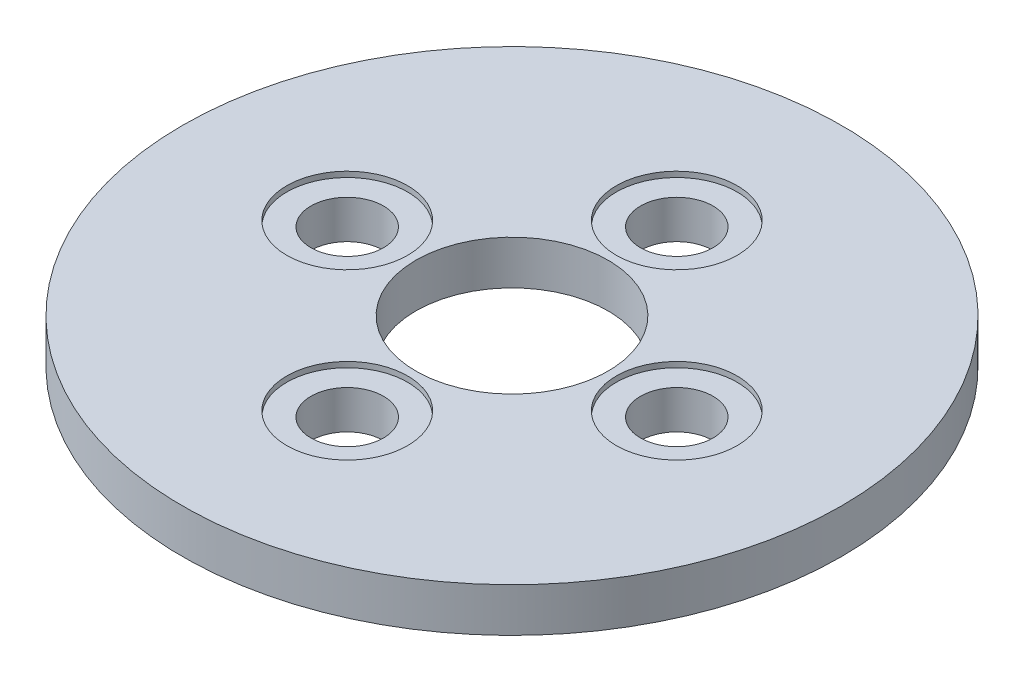
ISO-10303-21;
HEADER;
FILE_DESCRIPTION(('STEP AP214'),'2;1');
FILE_NAME('part.step','',(''),(''),'','','');
FILE_SCHEMA(('AUTOMOTIVE_DESIGN { 1 0 10303 214 1 1 1 1 }'));
ENDSEC;
DATA;
#1=APPLICATION_CONTEXT('core data for automotive mechanical design processes');
#2=APPLICATION_PROTOCOL_DEFINITION('international standard','automotive_design',2000,#1);
#3=PRODUCT_CONTEXT('',#1,'mechanical');
#4=PRODUCT('Part','Part','',(#3));
#5=PRODUCT_RELATED_PRODUCT_CATEGORY('part','',(#4));
#6=PRODUCT_DEFINITION_FORMATION('','',#4);
#7=PRODUCT_DEFINITION_CONTEXT('part definition',#1,'design');
#8=PRODUCT_DEFINITION('design','',#6,#7);
#9=PRODUCT_DEFINITION_SHAPE('','',#8);
#10=(LENGTH_UNIT() NAMED_UNIT(*) SI_UNIT(.MILLI.,.METRE.));
#11=(NAMED_UNIT(*) PLANE_ANGLE_UNIT() SI_UNIT($,.RADIAN.));
#12=(NAMED_UNIT(*) SI_UNIT($,.STERADIAN.) SOLID_ANGLE_UNIT());
#13=UNCERTAINTY_MEASURE_WITH_UNIT(LENGTH_MEASURE(1.E-05),#10,'distance_accuracy_value','');
#14=(GEOMETRIC_REPRESENTATION_CONTEXT(3) GLOBAL_UNCERTAINTY_ASSIGNED_CONTEXT((#13)) GLOBAL_UNIT_ASSIGNED_CONTEXT((#10,
#11,#12)) REPRESENTATION_CONTEXT('',''));
#15=CARTESIAN_POINT('',(0.,0.,0.));
#16=DIRECTION('',(0.,0.,1.));
#17=DIRECTION('',(1.,0.,0.));
#18=AXIS2_PLACEMENT_3D('',#15,#16,#17);
#19=CARTESIAN_POINT('',(0.,4.,0.));
#20=DIRECTION('',(0.,-1.,0.));
#21=DIRECTION('',(1.,0.,0.));
#22=AXIS2_PLACEMENT_3D('',#19,#20,#21);
#23=PLANE('',#22);
#24=CARTESIAN_POINT('',(15.,4.,0.));
#25=DIRECTION('',(0.,1.,0.));
#26=DIRECTION('',(0.,0.,1.));
#27=AXIS2_PLACEMENT_3D('',#24,#25,#26);
#28=CIRCLE('',#27,5.49999999999999);
#29=CARTESIAN_POINT('',(15.,4.,5.49999999999999));
#30=VERTEX_POINT('',#29);
#31=EDGE_CURVE('E122',#30,#30,#28,.T.);
#32=ORIENTED_EDGE('',*,*,#31,.F.);
#33=EDGE_LOOP('',(#32));
#34=FACE_BOUND('',#33,.T.);
#35=CARTESIAN_POINT('',(0.,4.,15.));
#36=DIRECTION('',(0.,1.,0.));
#37=DIRECTION('',(0.,0.,1.));
#38=AXIS2_PLACEMENT_3D('',#35,#36,#37);
#39=CIRCLE('',#38,5.49999999999999);
#40=CARTESIAN_POINT('',(0.,4.,20.5));
#41=VERTEX_POINT('',#40);
#42=EDGE_CURVE('E106',#41,#41,#39,.T.);
#43=ORIENTED_EDGE('',*,*,#42,.F.);
#44=EDGE_LOOP('',(#43));
#45=FACE_BOUND('',#44,.T.);
#46=CARTESIAN_POINT('',(-15.,4.,0.));
#47=DIRECTION('',(0.,1.,0.));
#48=DIRECTION('',(0.,0.,1.));
#49=AXIS2_PLACEMENT_3D('',#46,#47,#48);
#50=CIRCLE('',#49,5.49999999999999);
#51=CARTESIAN_POINT('',(-15.,4.,5.49999999999999));
#52=VERTEX_POINT('',#51);
#53=EDGE_CURVE('E90',#52,#52,#50,.T.);
#54=ORIENTED_EDGE('',*,*,#53,.F.);
#55=EDGE_LOOP('',(#54));
#56=FACE_BOUND('',#55,.T.);
#57=CARTESIAN_POINT('',(0.,4.,-15.));
#58=DIRECTION('',(0.,1.,0.));
#59=DIRECTION('',(0.,0.,1.));
#60=AXIS2_PLACEMENT_3D('',#57,#58,#59);
#61=CIRCLE('',#60,5.49999999999999);
#62=CARTESIAN_POINT('',(0.,4.,-9.50000000000001));
#63=VERTEX_POINT('',#62);
#64=EDGE_CURVE('E74',#63,#63,#61,.T.);
#65=ORIENTED_EDGE('',*,*,#64,.F.);
#66=EDGE_LOOP('',(#65));
#67=FACE_BOUND('',#66,.T.);
#68=CARTESIAN_POINT('',(0.,4.,0.));
#69=DIRECTION('',(0.,1.,0.));
#70=DIRECTION('',(-1.,0.,0.));
#71=AXIS2_PLACEMENT_3D('',#68,#69,#70);
#72=CIRCLE('',#71,8.75);
#73=CARTESIAN_POINT('',(-8.75,4.,0.));
#74=VERTEX_POINT('',#73);
#75=EDGE_CURVE('E10',#74,#74,#72,.T.);
#76=ORIENTED_EDGE('',*,*,#75,.F.);
#77=EDGE_LOOP('',(#76));
#78=FACE_BOUND('',#77,.T.);
#79=CARTESIAN_POINT('',(0.,4.,0.));
#80=DIRECTION('',(0.,1.,0.));
#81=DIRECTION('',(-1.,0.,0.));
#82=AXIS2_PLACEMENT_3D('',#79,#80,#81);
#83=CIRCLE('',#82,30.);
#84=CARTESIAN_POINT('',(-30.,4.,0.));
#85=VERTEX_POINT('',#84);
#86=EDGE_CURVE('E56',#85,#85,#83,.T.);
#87=ORIENTED_EDGE('',*,*,#86,.T.);
#88=EDGE_LOOP('',(#87));
#89=FACE_BOUND('',#88,.T.);
#90=ADVANCED_FACE('F39',(#34,#45,#56,#67,#78,#89),#23,.F.);
#91=CARTESIAN_POINT('',(0.,4.,0.));
#92=DIRECTION('',(0.,1.,0.));
#93=DIRECTION('',(-1.,0.,0.));
#94=AXIS2_PLACEMENT_3D('',#91,#92,#93);
#95=CYLINDRICAL_SURFACE('',#94,8.75);
#96=CARTESIAN_POINT('',(0.,0.,0.));
#97=DIRECTION('',(0.,1.,0.));
#98=DIRECTION('',(-1.,0.,0.));
#99=AXIS2_PLACEMENT_3D('',#96,#97,#98);
#100=CIRCLE('',#99,8.75);
#101=CARTESIAN_POINT('',(-8.75,0.,0.));
#102=VERTEX_POINT('',#101);
#103=EDGE_CURVE('E46',#102,#102,#100,.T.);
#104=ORIENTED_EDGE('',*,*,#103,.F.);
#105=EDGE_LOOP('',(#104));
#106=FACE_BOUND('',#105,.T.);
#107=ORIENTED_EDGE('',*,*,#75,.T.);
#108=EDGE_LOOP('',(#107));
#109=FACE_BOUND('',#108,.T.);
#110=ADVANCED_FACE('F131',(#106,#109),#95,.F.);
#111=CARTESIAN_POINT('',(0.,0.,0.));
#112=DIRECTION('',(0.,1.,0.));
#113=DIRECTION('',(-1.,0.,0.));
#114=AXIS2_PLACEMENT_3D('',#111,#112,#113);
#115=PLANE('',#114);
#116=CARTESIAN_POINT('',(15.,0.,0.));
#117=DIRECTION('',(0.,1.,0.));
#118=DIRECTION('',(0.,0.,1.));
#119=AXIS2_PLACEMENT_3D('',#116,#117,#118);
#120=CIRCLE('',#119,3.3);
#121=CARTESIAN_POINT('',(15.,0.,3.3));
#122=VERTEX_POINT('',#121);
#123=EDGE_CURVE('E110',#122,#122,#120,.T.);
#124=ORIENTED_EDGE('',*,*,#123,.T.);
#125=EDGE_LOOP('',(#124));
#126=FACE_BOUND('',#125,.T.);
#127=CARTESIAN_POINT('',(0.,0.,15.));
#128=DIRECTION('',(0.,1.,0.));
#129=DIRECTION('',(0.,0.,1.));
#130=AXIS2_PLACEMENT_3D('',#127,#128,#129);
#131=CIRCLE('',#130,3.3);
#132=CARTESIAN_POINT('',(0.,0.,18.3));
#133=VERTEX_POINT('',#132);
#134=EDGE_CURVE('E94',#133,#133,#131,.T.);
#135=ORIENTED_EDGE('',*,*,#134,.T.);
#136=EDGE_LOOP('',(#135));
#137=FACE_BOUND('',#136,.T.);
#138=CARTESIAN_POINT('',(-15.,0.,0.));
#139=DIRECTION('',(0.,1.,0.));
#140=DIRECTION('',(0.,0.,1.));
#141=AXIS2_PLACEMENT_3D('',#138,#139,#140);
#142=CIRCLE('',#141,3.3);
#143=CARTESIAN_POINT('',(-15.,0.,3.3));
#144=VERTEX_POINT('',#143);
#145=EDGE_CURVE('E78',#144,#144,#142,.T.);
#146=ORIENTED_EDGE('',*,*,#145,.T.);
#147=EDGE_LOOP('',(#146));
#148=FACE_BOUND('',#147,.T.);
#149=CARTESIAN_POINT('',(0.,0.,-15.));
#150=DIRECTION('',(0.,1.,0.));
#151=DIRECTION('',(0.,0.,1.));
#152=AXIS2_PLACEMENT_3D('',#149,#150,#151);
#153=CIRCLE('',#152,3.3);
#154=CARTESIAN_POINT('',(0.,0.,-11.7));
#155=VERTEX_POINT('',#154);
#156=EDGE_CURVE('E62',#155,#155,#153,.T.);
#157=ORIENTED_EDGE('',*,*,#156,.T.);
#158=EDGE_LOOP('',(#157));
#159=FACE_BOUND('',#158,.T.);
#160=CARTESIAN_POINT('',(0.,0.,0.));
#161=DIRECTION('',(0.,1.,0.));
#162=DIRECTION('',(-1.,0.,0.));
#163=AXIS2_PLACEMENT_3D('',#160,#161,#162);
#164=CIRCLE('',#163,30.);
#165=CARTESIAN_POINT('',(-30.,0.,0.));
#166=VERTEX_POINT('',#165);
#167=EDGE_CURVE('E51',#166,#166,#164,.T.);
#168=ORIENTED_EDGE('',*,*,#167,.F.);
#169=EDGE_LOOP('',(#168));
#170=FACE_BOUND('',#169,.T.);
#171=ORIENTED_EDGE('',*,*,#103,.T.);
#172=EDGE_LOOP('',(#171));
#173=FACE_BOUND('',#172,.T.);
#174=ADVANCED_FACE('F145',(#126,#137,#148,#159,#170,#173),#115,.F.);
#175=CARTESIAN_POINT('',(0.,4.,0.));
#176=DIRECTION('',(0.,1.,0.));
#177=DIRECTION('',(-1.,0.,0.));
#178=AXIS2_PLACEMENT_3D('',#175,#176,#177);
#179=CYLINDRICAL_SURFACE('',#178,30.);
#180=ORIENTED_EDGE('',*,*,#86,.F.);
#181=EDGE_LOOP('',(#180));
#182=FACE_BOUND('',#181,.T.);
#183=ORIENTED_EDGE('',*,*,#167,.T.);
#184=EDGE_LOOP('',(#183));
#185=FACE_BOUND('',#184,.T.);
#186=ADVANCED_FACE('F141',(#182,#185),#179,.T.);
#187=CARTESIAN_POINT('',(0.,4.,-15.));
#188=DIRECTION('',(0.,1.,0.));
#189=DIRECTION('',(0.,0.,1.));
#190=AXIS2_PLACEMENT_3D('',#187,#188,#189);
#191=CYLINDRICAL_SURFACE('',#190,3.3);
#192=ORIENTED_EDGE('',*,*,#156,.F.);
#193=EDGE_LOOP('',(#192));
#194=FACE_BOUND('',#193,.T.);
#195=CARTESIAN_POINT('',(0.,3.5,-15.));
#196=DIRECTION('',(0.,1.,0.));
#197=DIRECTION('',(0.,0.,1.));
#198=AXIS2_PLACEMENT_3D('',#195,#196,#197);
#199=CIRCLE('',#198,3.3);
#200=CARTESIAN_POINT('',(0.,3.5,-11.7));
#201=VERTEX_POINT('',#200);
#202=EDGE_CURVE('E66',#201,#201,#199,.T.);
#203=ORIENTED_EDGE('',*,*,#202,.T.);
#204=EDGE_LOOP('',(#203));
#205=FACE_BOUND('',#204,.T.);
#206=ADVANCED_FACE('F144',(#194,#205),#191,.F.);
#207=CARTESIAN_POINT('',(3.3,3.5,-15.));
#208=DIRECTION('',(0.,-1.,0.));
#209=DIRECTION('',(0.,0.,-1.));
#210=AXIS2_PLACEMENT_3D('',#207,#208,#209);
#211=PLANE('',#210);
#212=ORIENTED_EDGE('',*,*,#202,.F.);
#213=EDGE_LOOP('',(#212));
#214=FACE_BOUND('',#213,.T.);
#215=CARTESIAN_POINT('',(0.,3.5,-15.));
#216=DIRECTION('',(0.,1.,0.));
#217=DIRECTION('',(0.,0.,1.));
#218=AXIS2_PLACEMENT_3D('',#215,#216,#217);
#219=CIRCLE('',#218,5.5);
#220=CARTESIAN_POINT('',(0.,3.5,-9.5));
#221=VERTEX_POINT('',#220);
#222=EDGE_CURVE('E70',#221,#221,#219,.T.);
#223=ORIENTED_EDGE('',*,*,#222,.T.);
#224=EDGE_LOOP('',(#223));
#225=FACE_BOUND('',#224,.T.);
#226=ADVANCED_FACE('F160',(#214,#225),#211,.F.);
#227=CARTESIAN_POINT('',(0.,4.,-15.));
#228=DIRECTION('',(0.,1.,0.));
#229=DIRECTION('',(0.,0.,1.));
#230=AXIS2_PLACEMENT_3D('',#227,#228,#229);
#231=CYLINDRICAL_SURFACE('',#230,5.5);
#232=ORIENTED_EDGE('',*,*,#222,.F.);
#233=EDGE_LOOP('',(#232));
#234=FACE_BOUND('',#233,.T.);
#235=ORIENTED_EDGE('',*,*,#64,.T.);
#236=EDGE_LOOP('',(#235));
#237=FACE_BOUND('',#236,.T.);
#238=ADVANCED_FACE('F164',(#234,#237),#231,.F.);
#239=CARTESIAN_POINT('',(-15.,4.,0.));
#240=DIRECTION('',(0.,1.,0.));
#241=DIRECTION('',(0.,0.,1.));
#242=AXIS2_PLACEMENT_3D('',#239,#240,#241);
#243=CYLINDRICAL_SURFACE('',#242,3.3);
#244=ORIENTED_EDGE('',*,*,#145,.F.);
#245=EDGE_LOOP('',(#244));
#246=FACE_BOUND('',#245,.T.);
#247=CARTESIAN_POINT('',(-15.,3.5,0.));
#248=DIRECTION('',(0.,1.,0.));
#249=DIRECTION('',(0.,0.,1.));
#250=AXIS2_PLACEMENT_3D('',#247,#248,#249);
#251=CIRCLE('',#250,3.3);
#252=CARTESIAN_POINT('',(-15.,3.5,3.3));
#253=VERTEX_POINT('',#252);
#254=EDGE_CURVE('E82',#253,#253,#251,.T.);
#255=ORIENTED_EDGE('',*,*,#254,.T.);
#256=EDGE_LOOP('',(#255));
#257=FACE_BOUND('',#256,.T.);
#258=ADVANCED_FACE('F168',(#246,#257),#243,.F.);
#259=CARTESIAN_POINT('',(-11.7,3.5,0.));
#260=DIRECTION('',(0.,-1.,0.));
#261=DIRECTION('',(0.,0.,-1.));
#262=AXIS2_PLACEMENT_3D('',#259,#260,#261);
#263=PLANE('',#262);
#264=ORIENTED_EDGE('',*,*,#254,.F.);
#265=EDGE_LOOP('',(#264));
#266=FACE_BOUND('',#265,.T.);
#267=CARTESIAN_POINT('',(-15.,3.5,0.));
#268=DIRECTION('',(0.,1.,0.));
#269=DIRECTION('',(0.,0.,1.));
#270=AXIS2_PLACEMENT_3D('',#267,#268,#269);
#271=CIRCLE('',#270,5.5);
#272=CARTESIAN_POINT('',(-15.,3.5,5.5));
#273=VERTEX_POINT('',#272);
#274=EDGE_CURVE('E86',#273,#273,#271,.T.);
#275=ORIENTED_EDGE('',*,*,#274,.T.);
#276=EDGE_LOOP('',(#275));
#277=FACE_BOUND('',#276,.T.);
#278=ADVANCED_FACE('F172',(#266,#277),#263,.F.);
#279=CARTESIAN_POINT('',(-15.,4.,0.));
#280=DIRECTION('',(0.,1.,0.));
#281=DIRECTION('',(0.,0.,1.));
#282=AXIS2_PLACEMENT_3D('',#279,#280,#281);
#283=CYLINDRICAL_SURFACE('',#282,5.5);
#284=ORIENTED_EDGE('',*,*,#274,.F.);
#285=EDGE_LOOP('',(#284));
#286=FACE_BOUND('',#285,.T.);
#287=ORIENTED_EDGE('',*,*,#53,.T.);
#288=EDGE_LOOP('',(#287));
#289=FACE_BOUND('',#288,.T.);
#290=ADVANCED_FACE('F176',(#286,#289),#283,.F.);
#291=CARTESIAN_POINT('',(0.,4.,15.));
#292=DIRECTION('',(0.,1.,0.));
#293=DIRECTION('',(0.,0.,1.));
#294=AXIS2_PLACEMENT_3D('',#291,#292,#293);
#295=CYLINDRICAL_SURFACE('',#294,3.3);
#296=ORIENTED_EDGE('',*,*,#134,.F.);
#297=EDGE_LOOP('',(#296));
#298=FACE_BOUND('',#297,.T.);
#299=CARTESIAN_POINT('',(0.,3.5,15.));
#300=DIRECTION('',(0.,1.,0.));
#301=DIRECTION('',(0.,0.,1.));
#302=AXIS2_PLACEMENT_3D('',#299,#300,#301);
#303=CIRCLE('',#302,3.3);
#304=CARTESIAN_POINT('',(0.,3.5,18.3));
#305=VERTEX_POINT('',#304);
#306=EDGE_CURVE('E98',#305,#305,#303,.T.);
#307=ORIENTED_EDGE('',*,*,#306,.T.);
#308=EDGE_LOOP('',(#307));
#309=FACE_BOUND('',#308,.T.);
#310=ADVANCED_FACE('F180',(#298,#309),#295,.F.);
#311=CARTESIAN_POINT('',(3.3,3.5,15.));
#312=DIRECTION('',(0.,-1.,0.));
#313=DIRECTION('',(0.,0.,-1.));
#314=AXIS2_PLACEMENT_3D('',#311,#312,#313);
#315=PLANE('',#314);
#316=ORIENTED_EDGE('',*,*,#306,.F.);
#317=EDGE_LOOP('',(#316));
#318=FACE_BOUND('',#317,.T.);
#319=CARTESIAN_POINT('',(0.,3.5,15.));
#320=DIRECTION('',(0.,1.,0.));
#321=DIRECTION('',(0.,0.,1.));
#322=AXIS2_PLACEMENT_3D('',#319,#320,#321);
#323=CIRCLE('',#322,5.5);
#324=CARTESIAN_POINT('',(0.,3.5,20.5));
#325=VERTEX_POINT('',#324);
#326=EDGE_CURVE('E102',#325,#325,#323,.T.);
#327=ORIENTED_EDGE('',*,*,#326,.T.);
#328=EDGE_LOOP('',(#327));
#329=FACE_BOUND('',#328,.T.);
#330=ADVANCED_FACE('F184',(#318,#329),#315,.F.);
#331=CARTESIAN_POINT('',(0.,4.,15.));
#332=DIRECTION('',(0.,1.,0.));
#333=DIRECTION('',(0.,0.,1.));
#334=AXIS2_PLACEMENT_3D('',#331,#332,#333);
#335=CYLINDRICAL_SURFACE('',#334,5.5);
#336=ORIENTED_EDGE('',*,*,#326,.F.);
#337=EDGE_LOOP('',(#336));
#338=FACE_BOUND('',#337,.T.);
#339=ORIENTED_EDGE('',*,*,#42,.T.);
#340=EDGE_LOOP('',(#339));
#341=FACE_BOUND('',#340,.T.);
#342=ADVANCED_FACE('F188',(#338,#341),#335,.F.);
#343=CARTESIAN_POINT('',(15.,4.,0.));
#344=DIRECTION('',(0.,1.,0.));
#345=DIRECTION('',(0.,0.,1.));
#346=AXIS2_PLACEMENT_3D('',#343,#344,#345);
#347=CYLINDRICAL_SURFACE('',#346,3.3);
#348=ORIENTED_EDGE('',*,*,#123,.F.);
#349=EDGE_LOOP('',(#348));
#350=FACE_BOUND('',#349,.T.);
#351=CARTESIAN_POINT('',(15.,3.5,0.));
#352=DIRECTION('',(0.,1.,0.));
#353=DIRECTION('',(0.,0.,1.));
#354=AXIS2_PLACEMENT_3D('',#351,#352,#353);
#355=CIRCLE('',#354,3.3);
#356=CARTESIAN_POINT('',(15.,3.5,3.3));
#357=VERTEX_POINT('',#356);
#358=EDGE_CURVE('E114',#357,#357,#355,.T.);
#359=ORIENTED_EDGE('',*,*,#358,.T.);
#360=EDGE_LOOP('',(#359));
#361=FACE_BOUND('',#360,.T.);
#362=ADVANCED_FACE('F192',(#350,#361),#347,.F.);
#363=CARTESIAN_POINT('',(18.3,3.5,0.));
#364=DIRECTION('',(0.,-1.,0.));
#365=DIRECTION('',(0.,0.,-1.));
#366=AXIS2_PLACEMENT_3D('',#363,#364,#365);
#367=PLANE('',#366);
#368=ORIENTED_EDGE('',*,*,#358,.F.);
#369=EDGE_LOOP('',(#368));
#370=FACE_BOUND('',#369,.T.);
#371=CARTESIAN_POINT('',(15.,3.5,0.));
#372=DIRECTION('',(0.,1.,0.));
#373=DIRECTION('',(0.,0.,1.));
#374=AXIS2_PLACEMENT_3D('',#371,#372,#373);
#375=CIRCLE('',#374,5.5);
#376=CARTESIAN_POINT('',(15.,3.5,5.5));
#377=VERTEX_POINT('',#376);
#378=EDGE_CURVE('E118',#377,#377,#375,.T.);
#379=ORIENTED_EDGE('',*,*,#378,.T.);
#380=EDGE_LOOP('',(#379));
#381=FACE_BOUND('',#380,.T.);
#382=ADVANCED_FACE('F196',(#370,#381),#367,.F.);
#383=CARTESIAN_POINT('',(15.,4.,0.));
#384=DIRECTION('',(0.,1.,0.));
#385=DIRECTION('',(0.,0.,1.));
#386=AXIS2_PLACEMENT_3D('',#383,#384,#385);
#387=CYLINDRICAL_SURFACE('',#386,5.5);
#388=ORIENTED_EDGE('',*,*,#378,.F.);
#389=EDGE_LOOP('',(#388));
#390=FACE_BOUND('',#389,.T.);
#391=ORIENTED_EDGE('',*,*,#31,.T.);
#392=EDGE_LOOP('',(#391));
#393=FACE_BOUND('',#392,.T.);
#394=ADVANCED_FACE('F127',(#390,#393),#387,.F.);
#395=CLOSED_SHELL('',(#90,#110,#174,#186,#206,#226,#238,#258,#278,#290,#310,#330,#342,#362,#382,#394));
#396=MANIFOLD_SOLID_BREP('B2',#395);
#397=ADVANCED_BREP_SHAPE_REPRESENTATION('',(#18,#396),#14);
#398=SHAPE_DEFINITION_REPRESENTATION(#9,#397);
ENDSEC;
END-ISO-10303-21;
